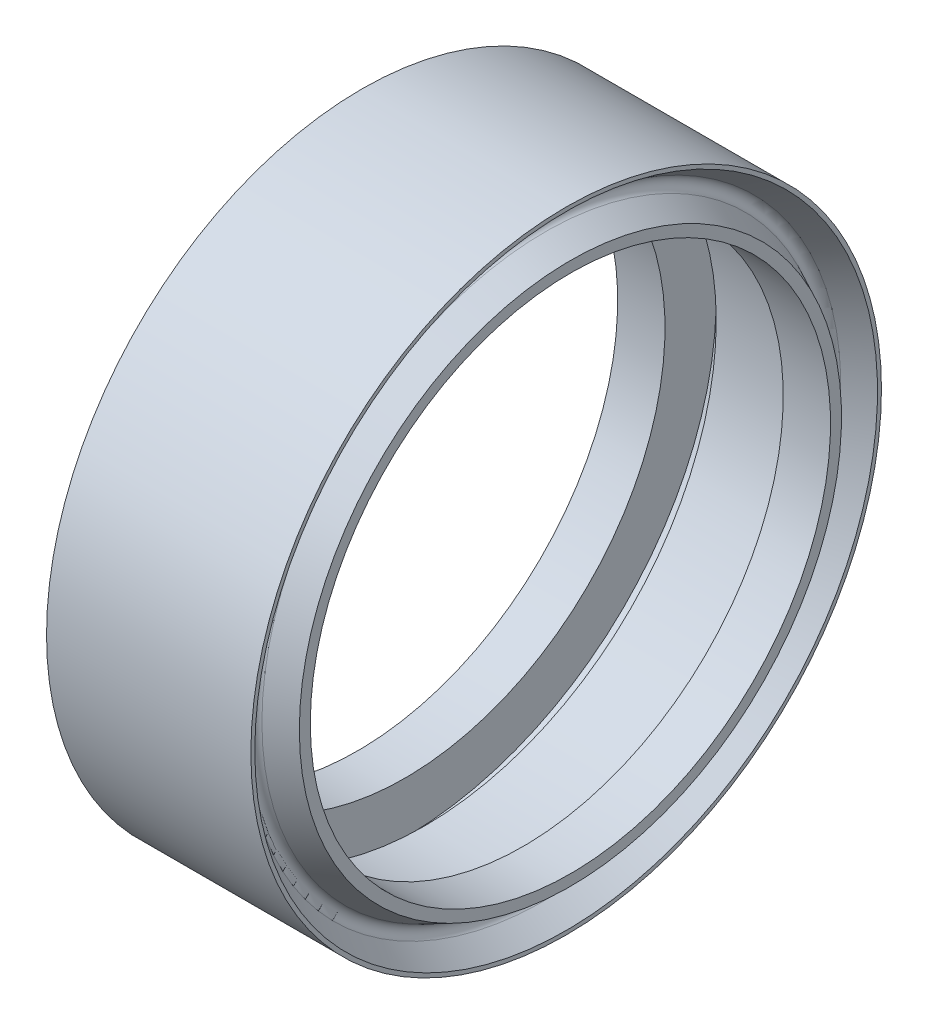
ISO-10303-21;
HEADER;
FILE_DESCRIPTION(('STEP AP214'),'2;1');
FILE_NAME('part.step','',(''),(''),'','','');
FILE_SCHEMA(('AUTOMOTIVE_DESIGN { 1 0 10303 214 1 1 1 1 }'));
ENDSEC;
DATA;
#1=APPLICATION_CONTEXT('core data for automotive mechanical design processes');
#2=APPLICATION_PROTOCOL_DEFINITION('international standard','automotive_design',2000,#1);
#3=PRODUCT_CONTEXT('',#1,'mechanical');
#4=PRODUCT('Part','Part','',(#3));
#5=PRODUCT_RELATED_PRODUCT_CATEGORY('part','',(#4));
#6=PRODUCT_DEFINITION_FORMATION('','',#4);
#7=PRODUCT_DEFINITION_CONTEXT('part definition',#1,'design');
#8=PRODUCT_DEFINITION('design','',#6,#7);
#9=PRODUCT_DEFINITION_SHAPE('','',#8);
#10=(LENGTH_UNIT() NAMED_UNIT(*) SI_UNIT(.MILLI.,.METRE.));
#11=(NAMED_UNIT(*) PLANE_ANGLE_UNIT() SI_UNIT($,.RADIAN.));
#12=(NAMED_UNIT(*) SI_UNIT($,.STERADIAN.) SOLID_ANGLE_UNIT());
#13=UNCERTAINTY_MEASURE_WITH_UNIT(LENGTH_MEASURE(1.E-05),#10,'distance_accuracy_value','');
#14=(GEOMETRIC_REPRESENTATION_CONTEXT(3) GLOBAL_UNCERTAINTY_ASSIGNED_CONTEXT((#13)) GLOBAL_UNIT_ASSIGNED_CONTEXT((#10,
#11,#12)) REPRESENTATION_CONTEXT('',''));
#15=CARTESIAN_POINT('',(0.,0.,0.));
#16=DIRECTION('',(0.,0.,1.));
#17=DIRECTION('',(1.,0.,0.));
#18=AXIS2_PLACEMENT_3D('',#15,#16,#17);
#19=CARTESIAN_POINT('',(10.8461007407681,33.,0.));
#20=DIRECTION('',(1.,0.,0.));
#21=DIRECTION('',(0.,0.,-1.));
#22=AXIS2_PLACEMENT_3D('',#19,#20,#21);
#23=PLANE('',#22);
#24=CARTESIAN_POINT('',(10.8461007407681,0.,0.));
#25=DIRECTION('',(-1.,0.,0.));
#26=DIRECTION('',(0.,0.,1.));
#27=AXIS2_PLACEMENT_3D('',#24,#25,#26);
#28=CIRCLE('',#27,33.);
#29=CARTESIAN_POINT('',(10.8461007407681,0.,33.));
#30=VERTEX_POINT('',#29);
#31=EDGE_CURVE('E94',#30,#30,#28,.T.);
#32=ORIENTED_EDGE('',*,*,#31,.F.);
#33=EDGE_LOOP('',(#32));
#34=FACE_BOUND('',#33,.T.);
#35=CARTESIAN_POINT('',(10.8461007407681,0.,0.));
#36=DIRECTION('',(-1.,0.,0.));
#37=DIRECTION('',(0.,0.,1.));
#38=AXIS2_PLACEMENT_3D('',#35,#36,#37);
#39=CIRCLE('',#38,34.3894430912189);
#40=CARTESIAN_POINT('',(10.8461007407681,0.,34.3894430912189));
#41=VERTEX_POINT('',#40);
#42=EDGE_CURVE('E10',#41,#41,#39,.T.);
#43=ORIENTED_EDGE('',*,*,#42,.T.);
#44=EDGE_LOOP('',(#43));
#45=FACE_BOUND('',#44,.T.);
#46=ADVANCED_FACE('F30',(#34,#45),#23,.F.);
#47=CARTESIAN_POINT('',(14.0687047841486,0.,0.));
#48=DIRECTION('',(1.,0.,0.));
#49=DIRECTION('',(0.,0.,-1.));
#50=AXIS2_PLACEMENT_3D('',#47,#48,#49);
#51=CONICAL_SURFACE('',#50,35.913637021947,0.441790456156088);
#52=ORIENTED_EDGE('',*,*,#42,.F.);
#53=EDGE_LOOP('',(#52));
#54=FACE_BOUND('',#53,.T.);
#55=CARTESIAN_POINT('',(14.0687047841486,0.,0.));
#56=DIRECTION('',(-1.,0.,0.));
#57=DIRECTION('',(0.,0.,1.));
#58=AXIS2_PLACEMENT_3D('',#55,#56,#57);
#59=CIRCLE('',#58,35.913637021947);
#60=CARTESIAN_POINT('',(14.0687047841486,0.,35.913637021947));
#61=VERTEX_POINT('',#60);
#62=EDGE_CURVE('E36',#61,#61,#59,.T.);
#63=ORIENTED_EDGE('',*,*,#62,.T.);
#64=EDGE_LOOP('',(#63));
#65=FACE_BOUND('',#64,.T.);
#66=ADVANCED_FACE('F101',(#54,#65),#51,.T.);
#67=CARTESIAN_POINT('',(13.6411460844869,0.,0.));
#68=DIRECTION('',(-1.,0.,0.));
#69=DIRECTION('',(0.,0.,1.));
#70=AXIS2_PLACEMENT_3D('',#67,#68,#69);
#71=TOROIDAL_SURFACE('',#70,36.8176246094412,0.999999999999996);
#72=ORIENTED_EDGE('',*,*,#62,.F.);
#73=EDGE_LOOP('',(#72));
#74=FACE_BOUND('',#73,.T.);
#75=CARTESIAN_POINT('',(14.1909779101611,0.,0.));
#76=DIRECTION('',(-1.,0.,0.));
#77=DIRECTION('',(0.,0.,1.));
#78=AXIS2_PLACEMENT_3D('',#75,#76,#77);
#79=CIRCLE('',#78,37.6528999912619);
#80=CARTESIAN_POINT('',(14.1909779101611,0.,37.6528999912619));
#81=VERTEX_POINT('',#80);
#82=EDGE_CURVE('E40',#81,#81,#79,.T.);
#83=ORIENTED_EDGE('',*,*,#82,.T.);
#84=EDGE_LOOP('',(#83));
#85=FACE_BOUND('',#84,.T.);
#86=ADVANCED_FACE('F105',(#74,#85),#71,.F.);
#87=CARTESIAN_POINT('',(11.3849614283616,0.,0.));
#88=DIRECTION('',(-1.,0.,0.));
#89=DIRECTION('',(0.,0.,1.));
#90=AXIS2_PLACEMENT_3D('',#87,#88,#89);
#91=CONICAL_SURFACE('',#90,39.5,0.582162884546775);
#92=ORIENTED_EDGE('',*,*,#82,.F.);
#93=EDGE_LOOP('',(#92));
#94=FACE_BOUND('',#93,.T.);
#95=CARTESIAN_POINT('',(11.3849614283616,0.,0.));
#96=DIRECTION('',(-1.,0.,0.));
#97=DIRECTION('',(0.,0.,1.));
#98=AXIS2_PLACEMENT_3D('',#95,#96,#97);
#99=CIRCLE('',#98,39.5);
#100=CARTESIAN_POINT('',(11.3849614283616,0.,39.5));
#101=VERTEX_POINT('',#100);
#102=EDGE_CURVE('E44',#101,#101,#99,.T.);
#103=ORIENTED_EDGE('',*,*,#102,.T.);
#104=EDGE_LOOP('',(#103));
#105=FACE_BOUND('',#104,.T.);
#106=ADVANCED_FACE('F110',(#94,#105),#91,.F.);
#107=CARTESIAN_POINT('',(11.3849614283616,39.5,0.));
#108=DIRECTION('',(1.,0.,0.));
#109=DIRECTION('',(0.,0.,-1.));
#110=AXIS2_PLACEMENT_3D('',#107,#108,#109);
#111=PLANE('',#110);
#112=ORIENTED_EDGE('',*,*,#102,.F.);
#113=EDGE_LOOP('',(#112));
#114=FACE_BOUND('',#113,.T.);
#115=CARTESIAN_POINT('',(11.3849614283616,0.,0.));
#116=DIRECTION('',(-1.,0.,0.));
#117=DIRECTION('',(0.,0.,1.));
#118=AXIS2_PLACEMENT_3D('',#115,#116,#117);
#119=CIRCLE('',#118,40.);
#120=CARTESIAN_POINT('',(11.3849614283616,0.,40.));
#121=VERTEX_POINT('',#120);
#122=EDGE_CURVE('E49',#121,#121,#119,.T.);
#123=ORIENTED_EDGE('',*,*,#122,.T.);
#124=EDGE_LOOP('',(#123));
#125=FACE_BOUND('',#124,.T.);
#126=ADVANCED_FACE('F116',(#114,#125),#111,.F.);
#127=CARTESIAN_POINT('',(0.,0.,0.));
#128=DIRECTION('',(-1.,0.,0.));
#129=DIRECTION('',(0.,0.,1.));
#130=AXIS2_PLACEMENT_3D('',#127,#128,#129);
#131=CYLINDRICAL_SURFACE('',#130,40.);
#132=ORIENTED_EDGE('',*,*,#122,.F.);
#133=EDGE_LOOP('',(#132));
#134=FACE_BOUND('',#133,.T.);
#135=CARTESIAN_POINT('',(37.3072400531747,0.,0.));
#136=DIRECTION('',(-1.,0.,0.));
#137=DIRECTION('',(0.,0.,1.));
#138=AXIS2_PLACEMENT_3D('',#135,#136,#137);
#139=CIRCLE('',#138,40.);
#140=CARTESIAN_POINT('',(37.3072400531747,0.,40.));
#141=VERTEX_POINT('',#140);
#142=EDGE_CURVE('E52',#141,#141,#139,.T.);
#143=ORIENTED_EDGE('',*,*,#142,.T.);
#144=EDGE_LOOP('',(#143));
#145=FACE_BOUND('',#144,.T.);
#146=ADVANCED_FACE('F120',(#134,#145),#131,.T.);
#147=CARTESIAN_POINT('',(37.3072400531747,39.5,0.));
#148=DIRECTION('',(-1.,0.,0.));
#149=DIRECTION('',(0.,0.,1.));
#150=AXIS2_PLACEMENT_3D('',#147,#148,#149);
#151=PLANE('',#150);
#152=ORIENTED_EDGE('',*,*,#142,.F.);
#153=EDGE_LOOP('',(#152));
#154=FACE_BOUND('',#153,.T.);
#155=CARTESIAN_POINT('',(37.3072400531747,0.,0.));
#156=DIRECTION('',(-1.,0.,0.));
#157=DIRECTION('',(0.,0.,1.));
#158=AXIS2_PLACEMENT_3D('',#155,#156,#157);
#159=CIRCLE('',#158,39.5);
#160=CARTESIAN_POINT('',(37.3072400531747,0.,39.5));
#161=VERTEX_POINT('',#160);
#162=EDGE_CURVE('E55',#161,#161,#159,.T.);
#163=ORIENTED_EDGE('',*,*,#162,.T.);
#164=EDGE_LOOP('',(#163));
#165=FACE_BOUND('',#164,.T.);
#166=ADVANCED_FACE('F124',(#154,#165),#151,.F.);
#167=CARTESIAN_POINT('',(34.5012235713751,0.,0.));
#168=DIRECTION('',(1.,0.,0.));
#169=DIRECTION('',(0.,0.,-1.));
#170=AXIS2_PLACEMENT_3D('',#167,#168,#169);
#171=CONICAL_SURFACE('',#170,37.6528999912619,0.582162884546774);
#172=ORIENTED_EDGE('',*,*,#162,.F.);
#173=EDGE_LOOP('',(#172));
#174=FACE_BOUND('',#173,.T.);
#175=CARTESIAN_POINT('',(34.5012235713751,0.,0.));
#176=DIRECTION('',(-1.,0.,0.));
#177=DIRECTION('',(0.,0.,1.));
#178=AXIS2_PLACEMENT_3D('',#175,#176,#177);
#179=CIRCLE('',#178,37.6528999912619);
#180=CARTESIAN_POINT('',(34.5012235713751,0.,37.6528999912619));
#181=VERTEX_POINT('',#180);
#182=EDGE_CURVE('E58',#181,#181,#179,.T.);
#183=ORIENTED_EDGE('',*,*,#182,.T.);
#184=EDGE_LOOP('',(#183));
#185=FACE_BOUND('',#184,.T.);
#186=ADVANCED_FACE('F128',(#174,#185),#171,.F.);
#187=CARTESIAN_POINT('',(35.0510553970493,0.,0.));
#188=DIRECTION('',(-1.,0.,0.));
#189=DIRECTION('',(0.,0.,1.));
#190=AXIS2_PLACEMENT_3D('',#187,#188,#189);
#191=TOROIDAL_SURFACE('',#190,36.8176246094412,0.999999999999996);
#192=ORIENTED_EDGE('',*,*,#182,.F.);
#193=EDGE_LOOP('',(#192));
#194=FACE_BOUND('',#193,.T.);
#195=CARTESIAN_POINT('',(34.6234966973876,0.,0.));
#196=DIRECTION('',(-1.,0.,0.));
#197=DIRECTION('',(0.,0.,1.));
#198=AXIS2_PLACEMENT_3D('',#195,#196,#197);
#199=CIRCLE('',#198,35.913637021947);
#200=CARTESIAN_POINT('',(34.6234966973876,0.,35.913637021947));
#201=VERTEX_POINT('',#200);
#202=EDGE_CURVE('E61',#201,#201,#199,.T.);
#203=ORIENTED_EDGE('',*,*,#202,.T.);
#204=EDGE_LOOP('',(#203));
#205=FACE_BOUND('',#204,.T.);
#206=ADVANCED_FACE('F132',(#194,#205),#191,.F.);
#207=CARTESIAN_POINT('',(37.8461007407681,0.,0.));
#208=DIRECTION('',(-1.,0.,0.));
#209=DIRECTION('',(0.,0.,1.));
#210=AXIS2_PLACEMENT_3D('',#207,#208,#209);
#211=CONICAL_SURFACE('',#210,34.3894430912189,0.441790456156086);
#212=ORIENTED_EDGE('',*,*,#202,.F.);
#213=EDGE_LOOP('',(#212));
#214=FACE_BOUND('',#213,.T.);
#215=CARTESIAN_POINT('',(37.8461007407681,0.,0.));
#216=DIRECTION('',(-1.,0.,0.));
#217=DIRECTION('',(0.,0.,1.));
#218=AXIS2_PLACEMENT_3D('',#215,#216,#217);
#219=CIRCLE('',#218,34.3894430912189);
#220=CARTESIAN_POINT('',(37.8461007407681,0.,34.3894430912189));
#221=VERTEX_POINT('',#220);
#222=EDGE_CURVE('E64',#221,#221,#219,.T.);
#223=ORIENTED_EDGE('',*,*,#222,.T.);
#224=EDGE_LOOP('',(#223));
#225=FACE_BOUND('',#224,.T.);
#226=ADVANCED_FACE('F136',(#214,#225),#211,.T.);
#227=CARTESIAN_POINT('',(37.8461007407681,33.,0.));
#228=DIRECTION('',(-1.,0.,0.));
#229=DIRECTION('',(0.,0.,1.));
#230=AXIS2_PLACEMENT_3D('',#227,#228,#229);
#231=PLANE('',#230);
#232=ORIENTED_EDGE('',*,*,#222,.F.);
#233=EDGE_LOOP('',(#232));
#234=FACE_BOUND('',#233,.T.);
#235=CARTESIAN_POINT('',(37.8461007407681,0.,0.));
#236=DIRECTION('',(-1.,0.,0.));
#237=DIRECTION('',(0.,0.,1.));
#238=AXIS2_PLACEMENT_3D('',#235,#236,#237);
#239=CIRCLE('',#238,33.);
#240=CARTESIAN_POINT('',(37.8461007407681,0.,33.));
#241=VERTEX_POINT('',#240);
#242=EDGE_CURVE('E67',#241,#241,#239,.T.);
#243=ORIENTED_EDGE('',*,*,#242,.T.);
#244=EDGE_LOOP('',(#243));
#245=FACE_BOUND('',#244,.T.);
#246=ADVANCED_FACE('F140',(#234,#245),#231,.F.);
#247=CARTESIAN_POINT('',(0.,0.,0.));
#248=DIRECTION('',(-1.,0.,0.));
#249=DIRECTION('',(0.,0.,1.));
#250=AXIS2_PLACEMENT_3D('',#247,#248,#249);
#251=CYLINDRICAL_SURFACE('',#250,33.);
#252=ORIENTED_EDGE('',*,*,#242,.F.);
#253=EDGE_LOOP('',(#252));
#254=FACE_BOUND('',#253,.T.);
#255=CARTESIAN_POINT('',(31.8461007407681,0.,0.));
#256=DIRECTION('',(-1.,0.,0.));
#257=DIRECTION('',(0.,0.,1.));
#258=AXIS2_PLACEMENT_3D('',#255,#256,#257);
#259=CIRCLE('',#258,33.);
#260=CARTESIAN_POINT('',(31.8461007407681,0.,33.));
#261=VERTEX_POINT('',#260);
#262=EDGE_CURVE('E70',#261,#261,#259,.T.);
#263=ORIENTED_EDGE('',*,*,#262,.T.);
#264=EDGE_LOOP('',(#263));
#265=FACE_BOUND('',#264,.T.);
#266=ADVANCED_FACE('F144',(#254,#265),#251,.F.);
#267=CARTESIAN_POINT('',(31.8461007407681,39.5,0.));
#268=DIRECTION('',(1.,0.,0.));
#269=DIRECTION('',(0.,0.,-1.));
#270=AXIS2_PLACEMENT_3D('',#267,#268,#269);
#271=PLANE('',#270);
#272=ORIENTED_EDGE('',*,*,#262,.F.);
#273=EDGE_LOOP('',(#272));
#274=FACE_BOUND('',#273,.T.);
#275=CARTESIAN_POINT('',(31.8461007407681,0.,0.));
#276=DIRECTION('',(-1.,0.,0.));
#277=DIRECTION('',(0.,0.,1.));
#278=AXIS2_PLACEMENT_3D('',#275,#276,#277);
#279=CIRCLE('',#278,39.5);
#280=CARTESIAN_POINT('',(31.8461007407681,0.,39.5));
#281=VERTEX_POINT('',#280);
#282=EDGE_CURVE('E73',#281,#281,#279,.T.);
#283=ORIENTED_EDGE('',*,*,#282,.T.);
#284=EDGE_LOOP('',(#283));
#285=FACE_BOUND('',#284,.T.);
#286=ADVANCED_FACE('F148',(#274,#285),#271,.F.);
#287=CARTESIAN_POINT('',(0.,0.,0.));
#288=DIRECTION('',(-1.,0.,0.));
#289=DIRECTION('',(0.,0.,1.));
#290=AXIS2_PLACEMENT_3D('',#287,#288,#289);
#291=CYLINDRICAL_SURFACE('',#290,39.5);
#292=ORIENTED_EDGE('',*,*,#282,.F.);
#293=EDGE_LOOP('',(#292));
#294=FACE_BOUND('',#293,.T.);
#295=CARTESIAN_POINT('',(29.3461007407681,0.,0.));
#296=DIRECTION('',(-1.,0.,0.));
#297=DIRECTION('',(0.,0.,1.));
#298=AXIS2_PLACEMENT_3D('',#295,#296,#297);
#299=CIRCLE('',#298,39.5);
#300=CARTESIAN_POINT('',(29.3461007407681,0.,39.5));
#301=VERTEX_POINT('',#300);
#302=EDGE_CURVE('E76',#301,#301,#299,.T.);
#303=ORIENTED_EDGE('',*,*,#302,.T.);
#304=EDGE_LOOP('',(#303));
#305=FACE_BOUND('',#304,.T.);
#306=ADVANCED_FACE('F152',(#294,#305),#291,.F.);
#307=CARTESIAN_POINT('',(29.3461007407681,37.0000000000001,0.));
#308=DIRECTION('',(-1.,0.,0.));
#309=DIRECTION('',(0.,0.,1.));
#310=AXIS2_PLACEMENT_3D('',#307,#308,#309);
#311=PLANE('',#310);
#312=ORIENTED_EDGE('',*,*,#302,.F.);
#313=EDGE_LOOP('',(#312));
#314=FACE_BOUND('',#313,.T.);
#315=CARTESIAN_POINT('',(29.3461007407681,0.,0.));
#316=DIRECTION('',(-1.,0.,0.));
#317=DIRECTION('',(0.,0.,1.));
#318=AXIS2_PLACEMENT_3D('',#315,#316,#317);
#319=CIRCLE('',#318,37.0000000000001);
#320=CARTESIAN_POINT('',(29.3461007407681,0.,37.0000000000001));
#321=VERTEX_POINT('',#320);
#322=EDGE_CURVE('E79',#321,#321,#319,.T.);
#323=ORIENTED_EDGE('',*,*,#322,.T.);
#324=EDGE_LOOP('',(#323));
#325=FACE_BOUND('',#324,.T.);
#326=ADVANCED_FACE('F156',(#314,#325),#311,.F.);
#327=CARTESIAN_POINT('',(0.,0.,0.));
#328=DIRECTION('',(-1.,0.,0.));
#329=DIRECTION('',(0.,0.,1.));
#330=AXIS2_PLACEMENT_3D('',#327,#328,#329);
#331=CYLINDRICAL_SURFACE('',#330,37.0000000000001);
#332=ORIENTED_EDGE('',*,*,#322,.F.);
#333=EDGE_LOOP('',(#332));
#334=FACE_BOUND('',#333,.T.);
#335=CARTESIAN_POINT('',(19.3461007407681,0.,0.));
#336=DIRECTION('',(-1.,0.,0.));
#337=DIRECTION('',(0.,0.,1.));
#338=AXIS2_PLACEMENT_3D('',#335,#336,#337);
#339=CIRCLE('',#338,37.0000000000001);
#340=CARTESIAN_POINT('',(19.3461007407681,0.,37.0000000000001));
#341=VERTEX_POINT('',#340);
#342=EDGE_CURVE('E82',#341,#341,#339,.T.);
#343=ORIENTED_EDGE('',*,*,#342,.T.);
#344=EDGE_LOOP('',(#343));
#345=FACE_BOUND('',#344,.T.);
#346=ADVANCED_FACE('F160',(#334,#345),#331,.F.);
#347=CARTESIAN_POINT('',(19.3461007407681,37.0000000000001,0.));
#348=DIRECTION('',(1.,0.,0.));
#349=DIRECTION('',(0.,0.,-1.));
#350=AXIS2_PLACEMENT_3D('',#347,#348,#349);
#351=PLANE('',#350);
#352=ORIENTED_EDGE('',*,*,#342,.F.);
#353=EDGE_LOOP('',(#352));
#354=FACE_BOUND('',#353,.T.);
#355=CARTESIAN_POINT('',(19.3461007407681,0.,0.));
#356=DIRECTION('',(-1.,0.,0.));
#357=DIRECTION('',(0.,0.,1.));
#358=AXIS2_PLACEMENT_3D('',#355,#356,#357);
#359=CIRCLE('',#358,39.5);
#360=CARTESIAN_POINT('',(19.3461007407681,0.,39.5));
#361=VERTEX_POINT('',#360);
#362=EDGE_CURVE('E85',#361,#361,#359,.T.);
#363=ORIENTED_EDGE('',*,*,#362,.T.);
#364=EDGE_LOOP('',(#363));
#365=FACE_BOUND('',#364,.T.);
#366=ADVANCED_FACE('F164',(#354,#365),#351,.F.);
#367=CARTESIAN_POINT('',(0.,0.,0.));
#368=DIRECTION('',(-1.,0.,0.));
#369=DIRECTION('',(0.,0.,1.));
#370=AXIS2_PLACEMENT_3D('',#367,#368,#369);
#371=CYLINDRICAL_SURFACE('',#370,39.5);
#372=ORIENTED_EDGE('',*,*,#362,.F.);
#373=EDGE_LOOP('',(#372));
#374=FACE_BOUND('',#373,.T.);
#375=CARTESIAN_POINT('',(16.8461007407681,0.,0.));
#376=DIRECTION('',(-1.,0.,0.));
#377=DIRECTION('',(0.,0.,1.));
#378=AXIS2_PLACEMENT_3D('',#375,#376,#377);
#379=CIRCLE('',#378,39.5);
#380=CARTESIAN_POINT('',(16.8461007407681,0.,39.5));
#381=VERTEX_POINT('',#380);
#382=EDGE_CURVE('E88',#381,#381,#379,.T.);
#383=ORIENTED_EDGE('',*,*,#382,.T.);
#384=EDGE_LOOP('',(#383));
#385=FACE_BOUND('',#384,.T.);
#386=ADVANCED_FACE('F168',(#374,#385),#371,.F.);
#387=CARTESIAN_POINT('',(16.8461007407681,39.5,0.));
#388=DIRECTION('',(-1.,0.,0.));
#389=DIRECTION('',(0.,0.,1.));
#390=AXIS2_PLACEMENT_3D('',#387,#388,#389);
#391=PLANE('',#390);
#392=ORIENTED_EDGE('',*,*,#382,.F.);
#393=EDGE_LOOP('',(#392));
#394=FACE_BOUND('',#393,.T.);
#395=CARTESIAN_POINT('',(16.8461007407681,0.,0.));
#396=DIRECTION('',(-1.,0.,0.));
#397=DIRECTION('',(0.,0.,1.));
#398=AXIS2_PLACEMENT_3D('',#395,#396,#397);
#399=CIRCLE('',#398,33.);
#400=CARTESIAN_POINT('',(16.8461007407681,0.,33.));
#401=VERTEX_POINT('',#400);
#402=EDGE_CURVE('E91',#401,#401,#399,.T.);
#403=ORIENTED_EDGE('',*,*,#402,.T.);
#404=EDGE_LOOP('',(#403));
#405=FACE_BOUND('',#404,.T.);
#406=ADVANCED_FACE('F172',(#394,#405),#391,.F.);
#407=CARTESIAN_POINT('',(0.,0.,0.));
#408=DIRECTION('',(-1.,0.,0.));
#409=DIRECTION('',(0.,0.,1.));
#410=AXIS2_PLACEMENT_3D('',#407,#408,#409);
#411=CYLINDRICAL_SURFACE('',#410,33.);
#412=ORIENTED_EDGE('',*,*,#402,.F.);
#413=EDGE_LOOP('',(#412));
#414=FACE_BOUND('',#413,.T.);
#415=ORIENTED_EDGE('',*,*,#31,.T.);
#416=EDGE_LOOP('',(#415));
#417=FACE_BOUND('',#416,.T.);
#418=ADVANCED_FACE('F98',(#414,#417),#411,.F.);
#419=CLOSED_SHELL('',(#46,#66,#86,#106,#126,#146,#166,#186,#206,#226,#246,#266,#286,#306,#326,
#346,#366,#386,#406,#418));
#420=MANIFOLD_SOLID_BREP('B2',#419);
#421=ADVANCED_BREP_SHAPE_REPRESENTATION('',(#18,#420),#14);
#422=SHAPE_DEFINITION_REPRESENTATION(#9,#421);
ENDSEC;
END-ISO-10303-21;
